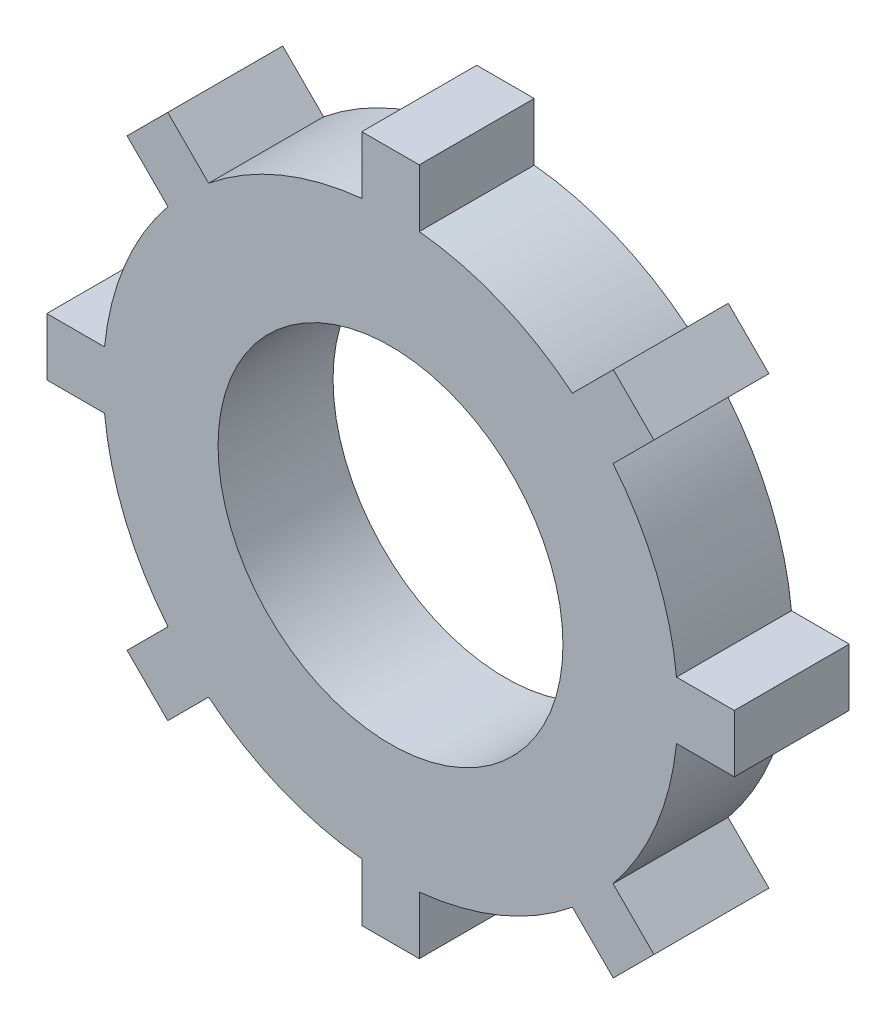
ISO-10303-21;
HEADER;
FILE_DESCRIPTION(('STEP AP214'),'2;1');
FILE_NAME('part.step','',(''),(''),'','','');
FILE_SCHEMA(('AUTOMOTIVE_DESIGN { 1 0 10303 214 1 1 1 1 }'));
ENDSEC;
DATA;
#1=APPLICATION_CONTEXT('core data for automotive mechanical design processes');
#2=APPLICATION_PROTOCOL_DEFINITION('international standard','automotive_design',2000,#1);
#3=PRODUCT_CONTEXT('',#1,'mechanical');
#4=PRODUCT('Part','Part','',(#3));
#5=PRODUCT_RELATED_PRODUCT_CATEGORY('part','',(#4));
#6=PRODUCT_DEFINITION_FORMATION('','',#4);
#7=PRODUCT_DEFINITION_CONTEXT('part definition',#1,'design');
#8=PRODUCT_DEFINITION('design','',#6,#7);
#9=PRODUCT_DEFINITION_SHAPE('','',#8);
#10=(LENGTH_UNIT() NAMED_UNIT(*) SI_UNIT(.MILLI.,.METRE.));
#11=(NAMED_UNIT(*) PLANE_ANGLE_UNIT() SI_UNIT($,.RADIAN.));
#12=(NAMED_UNIT(*) SI_UNIT($,.STERADIAN.) SOLID_ANGLE_UNIT());
#13=UNCERTAINTY_MEASURE_WITH_UNIT(LENGTH_MEASURE(1.E-05),#10,'distance_accuracy_value','');
#14=(GEOMETRIC_REPRESENTATION_CONTEXT(3) GLOBAL_UNCERTAINTY_ASSIGNED_CONTEXT((#13)) GLOBAL_UNIT_ASSIGNED_CONTEXT((#10,
#11,#12)) REPRESENTATION_CONTEXT('',''));
#15=CARTESIAN_POINT('',(0.,0.,0.));
#16=DIRECTION('',(0.,0.,1.));
#17=DIRECTION('',(1.,0.,0.));
#18=AXIS2_PLACEMENT_3D('',#15,#16,#17);
#19=CARTESIAN_POINT('',(0.,0.,10.));
#20=DIRECTION('',(0.,0.,1.));
#21=DIRECTION('',(1.,0.,0.));
#22=AXIS2_PLACEMENT_3D('',#19,#20,#21);
#23=PLANE('',#22);
#24=DIRECTION('',(-0.707106781186558,0.707106781186537,0.));
#25=VECTOR('',#24,1.);
#26=CARTESIAN_POINT('',(19.3780392557398,22.9135731616723,10.));
#27=LINE('',#26,#25);
#28=CARTESIAN_POINT('',(22.9135731616731,19.378039255739,10.));
#29=VERTEX_POINT('',#28);
#30=CARTESIAN_POINT('',(19.3780392557398,22.9135731616723,10.));
#31=VERTEX_POINT('',#30);
#32=EDGE_CURVE('E339',#29,#31,#27,.T.);
#33=ORIENTED_EDGE('',*,*,#32,.T.);
#34=DIRECTION('',(-0.707106781186546,-0.707106781186549,0.));
#35=VECTOR('',#34,1.);
#36=CARTESIAN_POINT('',(15.8212921463718,19.3568260523039,10.));
#37=LINE('',#36,#35);
#38=CARTESIAN_POINT('',(15.8212921463718,19.3568260523039,10.));
#39=VERTEX_POINT('',#38);
#40=EDGE_CURVE('E167',#31,#39,#37,.T.);
#41=ORIENTED_EDGE('',*,*,#40,.T.);
#42=CARTESIAN_POINT('',(0.,0.,10.));
#43=DIRECTION('',(0.,0.,1.));
#44=DIRECTION('',(1.,0.,0.));
#45=AXIS2_PLACEMENT_3D('',#42,#43,#44);
#46=CIRCLE('',#45,25.);
#47=CARTESIAN_POINT('',(2.49999999999975,24.8746859276655,10.));
#48=VERTEX_POINT('',#47);
#49=EDGE_CURVE('E426',#39,#48,#46,.T.);
#50=ORIENTED_EDGE('',*,*,#49,.T.);
#51=DIRECTION('',(0.,1.,0.));
#52=VECTOR('',#51,1.);
#53=CARTESIAN_POINT('',(2.49999999999995,29.9000000000001,10.));
#54=LINE('',#53,#52);
#55=CARTESIAN_POINT('',(2.49999999999995,29.9000000000001,10.));
#56=VERTEX_POINT('',#55);
#57=EDGE_CURVE('E445',#48,#56,#54,.T.);
#58=ORIENTED_EDGE('',*,*,#57,.T.);
#59=DIRECTION('',(-1.,0.,0.));
#60=VECTOR('',#59,1.);
#61=CARTESIAN_POINT('',(-2.5,29.8999999999999,10.));
#62=LINE('',#61,#60);
#63=CARTESIAN_POINT('',(-2.5,29.8999999999999,10.));
#64=VERTEX_POINT('',#63);
#65=EDGE_CURVE('E442',#56,#64,#62,.T.);
#66=ORIENTED_EDGE('',*,*,#65,.T.);
#67=DIRECTION('',(0.,-1.,0.));
#68=VECTOR('',#67,1.);
#69=CARTESIAN_POINT('',(-2.5,29.8999999999999,10.));
#70=LINE('',#69,#68);
#71=CARTESIAN_POINT('',(-2.49999999999997,24.8746859276655,10.));
#72=VERTEX_POINT('',#71);
#73=EDGE_CURVE('E444',#64,#72,#70,.T.);
#74=ORIENTED_EDGE('',*,*,#73,.T.);
#75=CARTESIAN_POINT('',(0.,0.,10.));
#76=DIRECTION('',(0.,0.,1.));
#77=DIRECTION('',(1.,0.,0.));
#78=AXIS2_PLACEMENT_3D('',#75,#76,#77);
#79=CIRCLE('',#78,25.);
#80=CARTESIAN_POINT('',(-15.8212921463718,19.3568260523043,10.));
#81=VERTEX_POINT('',#80);
#82=EDGE_CURVE('E447',#72,#81,#79,.T.);
#83=ORIENTED_EDGE('',*,*,#82,.T.);
#84=DIRECTION('',(-0.707106781186551,0.707106781186545,0.));
#85=VECTOR('',#84,1.);
#86=CARTESIAN_POINT('',(-15.8212921463718,19.3568260523043,10.));
#87=LINE('',#86,#85);
#88=CARTESIAN_POINT('',(-19.3780392557402,22.9135731616725,10.));
#89=VERTEX_POINT('',#88);
#90=EDGE_CURVE('E453',#81,#89,#87,.T.);
#91=ORIENTED_EDGE('',*,*,#90,.T.);
#92=DIRECTION('',(-0.707106781186544,-0.707106781186551,0.));
#93=VECTOR('',#92,1.);
#94=CARTESIAN_POINT('',(-19.3780392557402,22.9135731616725,10.));
#95=LINE('',#94,#93);
#96=CARTESIAN_POINT('',(-22.9135731616727,19.3780392557398,10.));
#97=VERTEX_POINT('',#96);
#98=EDGE_CURVE('E455',#89,#97,#95,.T.);
#99=ORIENTED_EDGE('',*,*,#98,.T.);
#100=DIRECTION('',(0.707106781186551,-0.707106781186545,0.));
#101=VECTOR('',#100,1.);
#102=CARTESIAN_POINT('',(-22.9135731616727,19.3780392557398,10.));
#103=LINE('',#102,#101);
#104=CARTESIAN_POINT('',(-19.3568260523045,15.8212921463713,10.));
#105=VERTEX_POINT('',#104);
#106=EDGE_CURVE('E457',#97,#105,#103,.T.);
#107=ORIENTED_EDGE('',*,*,#106,.T.);
#108=CARTESIAN_POINT('',(0.,0.,10.));
#109=DIRECTION('',(0.,0.,1.));
#110=DIRECTION('',(1.,0.,0.));
#111=AXIS2_PLACEMENT_3D('',#108,#109,#110);
#112=CIRCLE('',#111,25.);
#113=CARTESIAN_POINT('',(-24.8746859276658,2.49999999999995,10.));
#114=VERTEX_POINT('',#113);
#115=EDGE_CURVE('E459',#105,#114,#112,.T.);
#116=ORIENTED_EDGE('',*,*,#115,.T.);
#117=DIRECTION('',(-1.,0.,0.));
#118=VECTOR('',#117,1.);
#119=CARTESIAN_POINT('',(-29.9000000000003,2.49999999999995,10.));
#120=LINE('',#119,#118);
#121=CARTESIAN_POINT('',(-29.9000000000003,2.49999999999995,10.));
#122=VERTEX_POINT('',#121);
#123=EDGE_CURVE('E461',#114,#122,#120,.T.);
#124=ORIENTED_EDGE('',*,*,#123,.T.);
#125=DIRECTION('',(0.,-1.,0.));
#126=VECTOR('',#125,1.);
#127=CARTESIAN_POINT('',(-29.9000000000003,2.49999999999995,10.));
#128=LINE('',#127,#126);
#129=CARTESIAN_POINT('',(-29.8999999999997,-2.49999999999984,10.));
#130=VERTEX_POINT('',#129);
#131=EDGE_CURVE('E463',#122,#130,#128,.T.);
#132=ORIENTED_EDGE('',*,*,#131,.T.);
#133=DIRECTION('',(1.,0.,0.));
#134=VECTOR('',#133,1.);
#135=CARTESIAN_POINT('',(-29.8999999999997,-2.49999999999984,10.));
#136=LINE('',#135,#134);
#137=CARTESIAN_POINT('',(-24.8746859276656,-2.49999999999995,10.));
#138=VERTEX_POINT('',#137);
#139=EDGE_CURVE('E465',#130,#138,#136,.T.);
#140=ORIENTED_EDGE('',*,*,#139,.T.);
#141=CARTESIAN_POINT('',(0.,0.,10.));
#142=DIRECTION('',(0.,0.,1.));
#143=DIRECTION('',(1.,0.,0.));
#144=AXIS2_PLACEMENT_3D('',#141,#142,#143);
#145=CIRCLE('',#144,25.);
#146=CARTESIAN_POINT('',(-19.3568260523045,-15.8212921463717,10.));
#147=VERTEX_POINT('',#146);
#148=EDGE_CURVE('E467',#138,#147,#145,.T.);
#149=ORIENTED_EDGE('',*,*,#148,.T.);
#150=DIRECTION('',(-0.707106781186545,-0.707106781186551,0.));
#151=VECTOR('',#150,1.);
#152=CARTESIAN_POINT('',(-22.9135731616727,-19.37803925574,10.));
#153=LINE('',#152,#151);
#154=CARTESIAN_POINT('',(-22.9135731616727,-19.37803925574,10.));
#155=VERTEX_POINT('',#154);
#156=EDGE_CURVE('E469',#147,#155,#153,.T.);
#157=ORIENTED_EDGE('',*,*,#156,.T.);
#158=DIRECTION('',(0.707106781186549,-0.707106781186548,0.));
#159=VECTOR('',#158,1.);
#160=CARTESIAN_POINT('',(-19.3780392557398,-22.9135731616726,10.));
#161=LINE('',#160,#159);
#162=CARTESIAN_POINT('',(-19.3780392557398,-22.9135731616726,10.));
#163=VERTEX_POINT('',#162);
#164=EDGE_CURVE('E471',#155,#163,#161,.T.);
#165=ORIENTED_EDGE('',*,*,#164,.T.);
#166=DIRECTION('',(0.707106781186546,0.707106781186549,0.));
#167=VECTOR('',#166,1.);
#168=CARTESIAN_POINT('',(-15.8212921463716,-19.3568260523045,10.));
#169=LINE('',#168,#167);
#170=CARTESIAN_POINT('',(-15.8212921463716,-19.3568260523045,10.));
#171=VERTEX_POINT('',#170);
#172=EDGE_CURVE('E473',#163,#171,#169,.T.);
#173=ORIENTED_EDGE('',*,*,#172,.T.);
#174=CARTESIAN_POINT('',(0.,0.,10.));
#175=DIRECTION('',(0.,0.,1.));
#176=DIRECTION('',(1.,0.,0.));
#177=AXIS2_PLACEMENT_3D('',#174,#175,#176);
#178=CIRCLE('',#177,25.);
#179=CARTESIAN_POINT('',(-2.49999999999975,-24.8746859276656,10.));
#180=VERTEX_POINT('',#179);
#181=EDGE_CURVE('E475',#171,#180,#178,.T.);
#182=ORIENTED_EDGE('',*,*,#181,.T.);
#183=DIRECTION('',(0.,-1.,0.));
#184=VECTOR('',#183,1.);
#185=CARTESIAN_POINT('',(-2.49999999999975,-24.8746859276656,10.));
#186=LINE('',#185,#184);
#187=CARTESIAN_POINT('',(-2.49999999999986,-29.9000000000001,10.));
#188=VERTEX_POINT('',#187);
#189=EDGE_CURVE('E477',#180,#188,#186,.T.);
#190=ORIENTED_EDGE('',*,*,#189,.T.);
#191=DIRECTION('',(1.,0.,0.));
#192=VECTOR('',#191,1.);
#193=CARTESIAN_POINT('',(-2.49999999999986,-29.9000000000001,10.));
#194=LINE('',#193,#192);
#195=CARTESIAN_POINT('',(2.49999999999995,-29.9,10.));
#196=VERTEX_POINT('',#195);
#197=EDGE_CURVE('E479',#188,#196,#194,.T.);
#198=ORIENTED_EDGE('',*,*,#197,.T.);
#199=DIRECTION('',(0.,1.,0.));
#200=VECTOR('',#199,1.);
#201=CARTESIAN_POINT('',(2.4999999999997,-24.8746859276655,10.));
#202=LINE('',#201,#200);
#203=CARTESIAN_POINT('',(2.4999999999997,-24.8746859276655,10.));
#204=VERTEX_POINT('',#203);
#205=EDGE_CURVE('E481',#196,#204,#202,.T.);
#206=ORIENTED_EDGE('',*,*,#205,.T.);
#207=CARTESIAN_POINT('',(0.,0.,10.));
#208=DIRECTION('',(0.,0.,1.));
#209=DIRECTION('',(1.,0.,0.));
#210=AXIS2_PLACEMENT_3D('',#207,#208,#209);
#211=CIRCLE('',#210,25.);
#212=CARTESIAN_POINT('',(15.8212921463714,-19.3568260523041,10.));
#213=VERTEX_POINT('',#212);
#214=EDGE_CURVE('E483',#204,#213,#211,.T.);
#215=ORIENTED_EDGE('',*,*,#214,.T.);
#216=DIRECTION('',(0.707106781186551,-0.707106781186544,0.));
#217=VECTOR('',#216,1.);
#218=CARTESIAN_POINT('',(19.3780392557399,-22.9135731616726,10.));
#219=LINE('',#218,#217);
#220=CARTESIAN_POINT('',(19.3780392557399,-22.9135731616726,10.));
#221=VERTEX_POINT('',#220);
#222=EDGE_CURVE('E485',#213,#221,#219,.T.);
#223=ORIENTED_EDGE('',*,*,#222,.T.);
#224=DIRECTION('',(0.707106781186544,0.707106781186551,0.));
#225=VECTOR('',#224,1.);
#226=CARTESIAN_POINT('',(22.9135731616726,-19.3780392557399,10.));
#227=LINE('',#226,#225);
#228=CARTESIAN_POINT('',(22.9135731616726,-19.3780392557399,10.));
#229=VERTEX_POINT('',#228);
#230=EDGE_CURVE('E487',#221,#229,#227,.T.);
#231=ORIENTED_EDGE('',*,*,#230,.T.);
#232=DIRECTION('',(-0.707106781186552,0.707106781186544,0.));
#233=VECTOR('',#232,1.);
#234=CARTESIAN_POINT('',(19.356826052304,-15.8212921463714,10.));
#235=LINE('',#234,#233);
#236=CARTESIAN_POINT('',(19.356826052304,-15.8212921463714,10.));
#237=VERTEX_POINT('',#236);
#238=EDGE_CURVE('E489',#229,#237,#235,.T.);
#239=ORIENTED_EDGE('',*,*,#238,.T.);
#240=CARTESIAN_POINT('',(0.,0.,10.));
#241=DIRECTION('',(0.,0.,1.));
#242=DIRECTION('',(1.,0.,0.));
#243=AXIS2_PLACEMENT_3D('',#240,#241,#242);
#244=CIRCLE('',#243,25.);
#245=CARTESIAN_POINT('',(24.8746859276655,-2.50000000000028,10.));
#246=VERTEX_POINT('',#245);
#247=EDGE_CURVE('E491',#237,#246,#244,.T.);
#248=ORIENTED_EDGE('',*,*,#247,.T.);
#249=DIRECTION('',(1.,0.,0.));
#250=VECTOR('',#249,1.);
#251=CARTESIAN_POINT('',(24.8746859276655,-2.50000000000028,10.));
#252=LINE('',#251,#250);
#253=CARTESIAN_POINT('',(29.9000000000001,-2.50000000000022,10.));
#254=VERTEX_POINT('',#253);
#255=EDGE_CURVE('E493',#246,#254,#252,.T.);
#256=ORIENTED_EDGE('',*,*,#255,.T.);
#257=DIRECTION('',(0.,1.,0.));
#258=VECTOR('',#257,1.);
#259=CARTESIAN_POINT('',(29.8999999999998,2.5,10.));
#260=LINE('',#259,#258);
#261=CARTESIAN_POINT('',(29.8999999999998,2.5,10.));
#262=VERTEX_POINT('',#261);
#263=EDGE_CURVE('E258',#254,#262,#260,.T.);
#264=ORIENTED_EDGE('',*,*,#263,.T.);
#265=DIRECTION('',(-1.,0.,0.));
#266=VECTOR('',#265,1.);
#267=CARTESIAN_POINT('',(24.8746859276652,2.50000000000006,10.));
#268=LINE('',#267,#266);
#269=CARTESIAN_POINT('',(24.8746859276652,2.50000000000006,10.));
#270=VERTEX_POINT('',#269);
#271=EDGE_CURVE('E252',#262,#270,#268,.T.);
#272=ORIENTED_EDGE('',*,*,#271,.T.);
#273=CARTESIAN_POINT('',(0.,0.,10.));
#274=DIRECTION('',(0.,0.,1.));
#275=DIRECTION('',(1.,0.,0.));
#276=AXIS2_PLACEMENT_3D('',#273,#274,#275);
#277=CIRCLE('',#276,25.);
#278=CARTESIAN_POINT('',(19.3568260523045,15.8212921463712,10.));
#279=VERTEX_POINT('',#278);
#280=EDGE_CURVE('E256',#270,#279,#277,.T.);
#281=ORIENTED_EDGE('',*,*,#280,.T.);
#282=DIRECTION('',(0.70710678118664,0.707106781186457,0.));
#283=VECTOR('',#282,1.);
#284=CARTESIAN_POINT('',(22.9135731616731,19.378039255739,10.));
#285=LINE('',#284,#283);
#286=EDGE_CURVE('E52',#279,#29,#285,.T.);
#287=ORIENTED_EDGE('',*,*,#286,.T.);
#288=EDGE_LOOP('',(#33,#41,#50,#58,#66,#74,#83,#91,#99,#107,#116,#124,#132,#140,#149,#157,#165,
#173,#182,#190,#198,#206,#215,#223,#231,#239,#248,#256,#264,#272,#281,#287));
#289=FACE_BOUND('',#288,.T.);
#290=CARTESIAN_POINT('',(0.,0.,10.));
#291=DIRECTION('',(0.,0.,1.));
#292=DIRECTION('',(1.,0.,0.));
#293=AXIS2_PLACEMENT_3D('',#290,#291,#292);
#294=CIRCLE('',#293,15.);
#295=CARTESIAN_POINT('',(15.,0.,10.));
#296=VERTEX_POINT('',#295);
#297=EDGE_CURVE('E280',#296,#296,#294,.T.);
#298=ORIENTED_EDGE('',*,*,#297,.F.);
#299=EDGE_LOOP('',(#298));
#300=FACE_BOUND('',#299,.T.);
#301=ADVANCED_FACE('F35',(#289,#300),#23,.T.);
#302=CARTESIAN_POINT('',(0.,0.,0.));
#303=DIRECTION('',(0.,0.,1.));
#304=DIRECTION('',(1.,0.,0.));
#305=AXIS2_PLACEMENT_3D('',#302,#303,#304);
#306=PLANE('',#305);
#307=DIRECTION('',(-0.707106781186558,0.707106781186537,0.));
#308=VECTOR('',#307,1.);
#309=CARTESIAN_POINT('',(19.3780392557398,22.9135731616723,0.));
#310=LINE('',#309,#308);
#311=CARTESIAN_POINT('',(22.9135731616731,19.378039255739,0.));
#312=VERTEX_POINT('',#311);
#313=CARTESIAN_POINT('',(19.3780392557398,22.9135731616723,0.));
#314=VERTEX_POINT('',#313);
#315=EDGE_CURVE('E276',#312,#314,#310,.T.);
#316=ORIENTED_EDGE('',*,*,#315,.F.);
#317=DIRECTION('',(0.70710678118664,0.707106781186457,0.));
#318=VECTOR('',#317,1.);
#319=CARTESIAN_POINT('',(22.9135731616731,19.378039255739,0.));
#320=LINE('',#319,#318);
#321=CARTESIAN_POINT('',(19.3568260523045,15.8212921463712,0.));
#322=VERTEX_POINT('',#321);
#323=EDGE_CURVE('E159',#322,#312,#320,.T.);
#324=ORIENTED_EDGE('',*,*,#323,.F.);
#325=CARTESIAN_POINT('',(0.,0.,0.));
#326=DIRECTION('',(0.,0.,1.));
#327=DIRECTION('',(1.,0.,0.));
#328=AXIS2_PLACEMENT_3D('',#325,#326,#327);
#329=CIRCLE('',#328,25.);
#330=CARTESIAN_POINT('',(24.8746859276652,2.50000000000006,0.));
#331=VERTEX_POINT('',#330);
#332=EDGE_CURVE('E153',#331,#322,#329,.T.);
#333=ORIENTED_EDGE('',*,*,#332,.F.);
#334=DIRECTION('',(-1.,0.,0.));
#335=VECTOR('',#334,1.);
#336=CARTESIAN_POINT('',(24.8746859276652,2.50000000000006,0.));
#337=LINE('',#336,#335);
#338=CARTESIAN_POINT('',(29.8999999999998,2.5,0.));
#339=VERTEX_POINT('',#338);
#340=EDGE_CURVE('E266',#339,#331,#337,.T.);
#341=ORIENTED_EDGE('',*,*,#340,.F.);
#342=DIRECTION('',(0.,1.,0.));
#343=VECTOR('',#342,1.);
#344=CARTESIAN_POINT('',(29.8999999999998,2.5,0.));
#345=LINE('',#344,#343);
#346=CARTESIAN_POINT('',(29.9000000000001,-2.50000000000022,0.));
#347=VERTEX_POINT('',#346);
#348=EDGE_CURVE('E334',#347,#339,#345,.T.);
#349=ORIENTED_EDGE('',*,*,#348,.F.);
#350=DIRECTION('',(1.,0.,0.));
#351=VECTOR('',#350,1.);
#352=CARTESIAN_POINT('',(24.8746859276655,-2.50000000000028,0.));
#353=LINE('',#352,#351);
#354=CARTESIAN_POINT('',(24.8746859276655,-2.50000000000028,0.));
#355=VERTEX_POINT('',#354);
#356=EDGE_CURVE('E332',#355,#347,#353,.T.);
#357=ORIENTED_EDGE('',*,*,#356,.F.);
#358=CARTESIAN_POINT('',(0.,0.,0.));
#359=DIRECTION('',(0.,0.,1.));
#360=DIRECTION('',(1.,0.,0.));
#361=AXIS2_PLACEMENT_3D('',#358,#359,#360);
#362=CIRCLE('',#361,25.);
#363=CARTESIAN_POINT('',(19.356826052304,-15.8212921463714,0.));
#364=VERTEX_POINT('',#363);
#365=EDGE_CURVE('E330',#364,#355,#362,.T.);
#366=ORIENTED_EDGE('',*,*,#365,.F.);
#367=DIRECTION('',(-0.707106781186552,0.707106781186544,0.));
#368=VECTOR('',#367,1.);
#369=CARTESIAN_POINT('',(19.356826052304,-15.8212921463714,0.));
#370=LINE('',#369,#368);
#371=CARTESIAN_POINT('',(22.9135731616726,-19.3780392557399,0.));
#372=VERTEX_POINT('',#371);
#373=EDGE_CURVE('E328',#372,#364,#370,.T.);
#374=ORIENTED_EDGE('',*,*,#373,.F.);
#375=DIRECTION('',(0.707106781186544,0.707106781186551,0.));
#376=VECTOR('',#375,1.);
#377=CARTESIAN_POINT('',(22.9135731616726,-19.3780392557399,0.));
#378=LINE('',#377,#376);
#379=CARTESIAN_POINT('',(19.3780392557399,-22.9135731616726,0.));
#380=VERTEX_POINT('',#379);
#381=EDGE_CURVE('E326',#380,#372,#378,.T.);
#382=ORIENTED_EDGE('',*,*,#381,.F.);
#383=DIRECTION('',(0.707106781186551,-0.707106781186544,0.));
#384=VECTOR('',#383,1.);
#385=CARTESIAN_POINT('',(19.3780392557399,-22.9135731616726,0.));
#386=LINE('',#385,#384);
#387=CARTESIAN_POINT('',(15.8212921463714,-19.3568260523041,0.));
#388=VERTEX_POINT('',#387);
#389=EDGE_CURVE('E324',#388,#380,#386,.T.);
#390=ORIENTED_EDGE('',*,*,#389,.F.);
#391=CARTESIAN_POINT('',(0.,0.,0.));
#392=DIRECTION('',(0.,0.,1.));
#393=DIRECTION('',(1.,0.,0.));
#394=AXIS2_PLACEMENT_3D('',#391,#392,#393);
#395=CIRCLE('',#394,25.);
#396=CARTESIAN_POINT('',(2.4999999999997,-24.8746859276655,0.));
#397=VERTEX_POINT('',#396);
#398=EDGE_CURVE('E322',#397,#388,#395,.T.);
#399=ORIENTED_EDGE('',*,*,#398,.F.);
#400=DIRECTION('',(0.,1.,0.));
#401=VECTOR('',#400,1.);
#402=CARTESIAN_POINT('',(2.4999999999997,-24.8746859276655,0.));
#403=LINE('',#402,#401);
#404=CARTESIAN_POINT('',(2.49999999999995,-29.9,0.));
#405=VERTEX_POINT('',#404);
#406=EDGE_CURVE('E320',#405,#397,#403,.T.);
#407=ORIENTED_EDGE('',*,*,#406,.F.);
#408=DIRECTION('',(1.,0.,0.));
#409=VECTOR('',#408,1.);
#410=CARTESIAN_POINT('',(-2.49999999999986,-29.9000000000001,0.));
#411=LINE('',#410,#409);
#412=CARTESIAN_POINT('',(-2.49999999999986,-29.9000000000001,0.));
#413=VERTEX_POINT('',#412);
#414=EDGE_CURVE('E318',#413,#405,#411,.T.);
#415=ORIENTED_EDGE('',*,*,#414,.F.);
#416=DIRECTION('',(0.,-1.,0.));
#417=VECTOR('',#416,1.);
#418=CARTESIAN_POINT('',(-2.49999999999975,-24.8746859276656,0.));
#419=LINE('',#418,#417);
#420=CARTESIAN_POINT('',(-2.49999999999975,-24.8746859276656,0.));
#421=VERTEX_POINT('',#420);
#422=EDGE_CURVE('E316',#421,#413,#419,.T.);
#423=ORIENTED_EDGE('',*,*,#422,.F.);
#424=CARTESIAN_POINT('',(0.,0.,0.));
#425=DIRECTION('',(0.,0.,1.));
#426=DIRECTION('',(1.,0.,0.));
#427=AXIS2_PLACEMENT_3D('',#424,#425,#426);
#428=CIRCLE('',#427,25.);
#429=CARTESIAN_POINT('',(-15.8212921463716,-19.3568260523045,0.));
#430=VERTEX_POINT('',#429);
#431=EDGE_CURVE('E314',#430,#421,#428,.T.);
#432=ORIENTED_EDGE('',*,*,#431,.F.);
#433=DIRECTION('',(0.707106781186546,0.707106781186549,0.));
#434=VECTOR('',#433,1.);
#435=CARTESIAN_POINT('',(-15.8212921463716,-19.3568260523045,0.));
#436=LINE('',#435,#434);
#437=CARTESIAN_POINT('',(-19.3780392557398,-22.9135731616726,0.));
#438=VERTEX_POINT('',#437);
#439=EDGE_CURVE('E312',#438,#430,#436,.T.);
#440=ORIENTED_EDGE('',*,*,#439,.F.);
#441=DIRECTION('',(0.707106781186549,-0.707106781186548,0.));
#442=VECTOR('',#441,1.);
#443=CARTESIAN_POINT('',(-19.3780392557398,-22.9135731616726,0.));
#444=LINE('',#443,#442);
#445=CARTESIAN_POINT('',(-22.9135731616727,-19.37803925574,0.));
#446=VERTEX_POINT('',#445);
#447=EDGE_CURVE('E310',#446,#438,#444,.T.);
#448=ORIENTED_EDGE('',*,*,#447,.F.);
#449=DIRECTION('',(-0.707106781186545,-0.707106781186551,0.));
#450=VECTOR('',#449,1.);
#451=CARTESIAN_POINT('',(-22.9135731616727,-19.37803925574,0.));
#452=LINE('',#451,#450);
#453=CARTESIAN_POINT('',(-19.3568260523045,-15.8212921463717,0.));
#454=VERTEX_POINT('',#453);
#455=EDGE_CURVE('E308',#454,#446,#452,.T.);
#456=ORIENTED_EDGE('',*,*,#455,.F.);
#457=CARTESIAN_POINT('',(0.,0.,0.));
#458=DIRECTION('',(0.,0.,1.));
#459=DIRECTION('',(1.,0.,0.));
#460=AXIS2_PLACEMENT_3D('',#457,#458,#459);
#461=CIRCLE('',#460,25.);
#462=CARTESIAN_POINT('',(-24.8746859276656,-2.49999999999995,0.));
#463=VERTEX_POINT('',#462);
#464=EDGE_CURVE('E306',#463,#454,#461,.T.);
#465=ORIENTED_EDGE('',*,*,#464,.F.);
#466=DIRECTION('',(1.,0.,0.));
#467=VECTOR('',#466,1.);
#468=CARTESIAN_POINT('',(-29.8999999999997,-2.49999999999984,0.));
#469=LINE('',#468,#467);
#470=CARTESIAN_POINT('',(-29.8999999999997,-2.49999999999984,0.));
#471=VERTEX_POINT('',#470);
#472=EDGE_CURVE('E304',#471,#463,#469,.T.);
#473=ORIENTED_EDGE('',*,*,#472,.F.);
#474=DIRECTION('',(0.,-1.,0.));
#475=VECTOR('',#474,1.);
#476=CARTESIAN_POINT('',(-29.9000000000003,2.49999999999995,0.));
#477=LINE('',#476,#475);
#478=CARTESIAN_POINT('',(-29.9000000000003,2.49999999999995,0.));
#479=VERTEX_POINT('',#478);
#480=EDGE_CURVE('E302',#479,#471,#477,.T.);
#481=ORIENTED_EDGE('',*,*,#480,.F.);
#482=DIRECTION('',(-1.,0.,0.));
#483=VECTOR('',#482,1.);
#484=CARTESIAN_POINT('',(-29.9000000000003,2.49999999999995,0.));
#485=LINE('',#484,#483);
#486=CARTESIAN_POINT('',(-24.8746859276658,2.49999999999995,0.));
#487=VERTEX_POINT('',#486);
#488=EDGE_CURVE('E300',#487,#479,#485,.T.);
#489=ORIENTED_EDGE('',*,*,#488,.F.);
#490=CARTESIAN_POINT('',(0.,0.,0.));
#491=DIRECTION('',(0.,0.,1.));
#492=DIRECTION('',(1.,0.,0.));
#493=AXIS2_PLACEMENT_3D('',#490,#491,#492);
#494=CIRCLE('',#493,25.);
#495=CARTESIAN_POINT('',(-19.3568260523045,15.8212921463713,0.));
#496=VERTEX_POINT('',#495);
#497=EDGE_CURVE('E298',#496,#487,#494,.T.);
#498=ORIENTED_EDGE('',*,*,#497,.F.);
#499=DIRECTION('',(0.707106781186551,-0.707106781186545,0.));
#500=VECTOR('',#499,1.);
#501=CARTESIAN_POINT('',(-22.9135731616727,19.3780392557398,0.));
#502=LINE('',#501,#500);
#503=CARTESIAN_POINT('',(-22.9135731616727,19.3780392557398,0.));
#504=VERTEX_POINT('',#503);
#505=EDGE_CURVE('E296',#504,#496,#502,.T.);
#506=ORIENTED_EDGE('',*,*,#505,.F.);
#507=DIRECTION('',(-0.707106781186544,-0.707106781186551,0.));
#508=VECTOR('',#507,1.);
#509=CARTESIAN_POINT('',(-19.3780392557402,22.9135731616725,0.));
#510=LINE('',#509,#508);
#511=CARTESIAN_POINT('',(-19.3780392557402,22.9135731616725,0.));
#512=VERTEX_POINT('',#511);
#513=EDGE_CURVE('E294',#512,#504,#510,.T.);
#514=ORIENTED_EDGE('',*,*,#513,.F.);
#515=DIRECTION('',(-0.707106781186551,0.707106781186545,0.));
#516=VECTOR('',#515,1.);
#517=CARTESIAN_POINT('',(-15.8212921463718,19.3568260523043,0.));
#518=LINE('',#517,#516);
#519=CARTESIAN_POINT('',(-15.8212921463718,19.3568260523043,0.));
#520=VERTEX_POINT('',#519);
#521=EDGE_CURVE('E292',#520,#512,#518,.T.);
#522=ORIENTED_EDGE('',*,*,#521,.F.);
#523=CARTESIAN_POINT('',(0.,0.,0.));
#524=DIRECTION('',(0.,0.,1.));
#525=DIRECTION('',(1.,0.,0.));
#526=AXIS2_PLACEMENT_3D('',#523,#524,#525);
#527=CIRCLE('',#526,25.);
#528=CARTESIAN_POINT('',(-2.49999999999997,24.8746859276655,0.));
#529=VERTEX_POINT('',#528);
#530=EDGE_CURVE('E290',#529,#520,#527,.T.);
#531=ORIENTED_EDGE('',*,*,#530,.F.);
#532=DIRECTION('',(0.,-1.,0.));
#533=VECTOR('',#532,1.);
#534=CARTESIAN_POINT('',(-2.5,29.8999999999999,0.));
#535=LINE('',#534,#533);
#536=CARTESIAN_POINT('',(-2.5,29.8999999999999,0.));
#537=VERTEX_POINT('',#536);
#538=EDGE_CURVE('E288',#537,#529,#535,.T.);
#539=ORIENTED_EDGE('',*,*,#538,.F.);
#540=DIRECTION('',(-1.,0.,0.));
#541=VECTOR('',#540,1.);
#542=CARTESIAN_POINT('',(-2.5,29.8999999999999,0.));
#543=LINE('',#542,#541);
#544=CARTESIAN_POINT('',(2.49999999999995,29.9000000000001,0.));
#545=VERTEX_POINT('',#544);
#546=EDGE_CURVE('E286',#545,#537,#543,.T.);
#547=ORIENTED_EDGE('',*,*,#546,.F.);
#548=DIRECTION('',(0.,1.,0.));
#549=VECTOR('',#548,1.);
#550=CARTESIAN_POINT('',(2.49999999999995,29.9000000000001,0.));
#551=LINE('',#550,#549);
#552=CARTESIAN_POINT('',(2.49999999999975,24.8746859276655,0.));
#553=VERTEX_POINT('',#552);
#554=EDGE_CURVE('E284',#553,#545,#551,.T.);
#555=ORIENTED_EDGE('',*,*,#554,.F.);
#556=CARTESIAN_POINT('',(0.,0.,0.));
#557=DIRECTION('',(0.,0.,1.));
#558=DIRECTION('',(1.,0.,0.));
#559=AXIS2_PLACEMENT_3D('',#556,#557,#558);
#560=CIRCLE('',#559,25.);
#561=CARTESIAN_POINT('',(15.8212921463718,19.3568260523039,0.));
#562=VERTEX_POINT('',#561);
#563=EDGE_CURVE('E282',#562,#553,#560,.T.);
#564=ORIENTED_EDGE('',*,*,#563,.F.);
#565=DIRECTION('',(-0.707106781186546,-0.707106781186549,0.));
#566=VECTOR('',#565,1.);
#567=CARTESIAN_POINT('',(15.8212921463718,19.3568260523039,0.));
#568=LINE('',#567,#566);
#569=EDGE_CURVE('E279',#314,#562,#568,.T.);
#570=ORIENTED_EDGE('',*,*,#569,.F.);
#571=EDGE_LOOP('',(#316,#324,#333,#341,#349,#357,#366,#374,#382,#390,#399,#407,#415,#423,#432,
#440,#448,#456,#465,#473,#481,#489,#498,#506,#514,#522,#531,#539,#547,#555,#564,#570));
#572=FACE_BOUND('',#571,.T.);
#573=CARTESIAN_POINT('',(0.,0.,0.));
#574=DIRECTION('',(0.,0.,1.));
#575=DIRECTION('',(1.,0.,0.));
#576=AXIS2_PLACEMENT_3D('',#573,#574,#575);
#577=CIRCLE('',#576,15.);
#578=CARTESIAN_POINT('',(15.,0.,0.));
#579=VERTEX_POINT('',#578);
#580=EDGE_CURVE('E830',#579,#579,#577,.T.);
#581=ORIENTED_EDGE('',*,*,#580,.T.);
#582=EDGE_LOOP('',(#581));
#583=FACE_BOUND('',#582,.T.);
#584=ADVANCED_FACE('F430',(#572,#583),#306,.F.);
#585=CARTESIAN_POINT('',(19.3780392557398,22.9135731616723,10.));
#586=DIRECTION('',(-0.707106781186537,-0.707106781186558,0.));
#587=DIRECTION('',(0.707106781186559,-0.707106781186537,0.));
#588=AXIS2_PLACEMENT_3D('',#585,#586,#587);
#589=PLANE('',#588);
#590=ORIENTED_EDGE('',*,*,#315,.T.);
#591=DIRECTION('',(0.,0.,-1.));
#592=VECTOR('',#591,1.);
#593=CARTESIAN_POINT('',(19.3780392557398,22.9135731616723,10.));
#594=LINE('',#593,#592);
#595=EDGE_CURVE('E11',#31,#314,#594,.T.);
#596=ORIENTED_EDGE('',*,*,#595,.F.);
#597=ORIENTED_EDGE('',*,*,#32,.F.);
#598=DIRECTION('',(0.,0.,-1.));
#599=VECTOR('',#598,1.);
#600=CARTESIAN_POINT('',(22.9135731616731,19.378039255739,10.));
#601=LINE('',#600,#599);
#602=EDGE_CURVE('E272',#29,#312,#601,.T.);
#603=ORIENTED_EDGE('',*,*,#602,.T.);
#604=EDGE_LOOP('',(#590,#596,#597,#603));
#605=FACE_BOUND('',#604,.T.);
#606=ADVANCED_FACE('F37',(#605),#589,.F.);
#607=CARTESIAN_POINT('',(15.8212921463718,19.3568260523039,10.));
#608=DIRECTION('',(0.707106781186549,-0.707106781186547,0.));
#609=DIRECTION('',(0.707106781186547,0.707106781186549,0.));
#610=AXIS2_PLACEMENT_3D('',#607,#608,#609);
#611=PLANE('',#610);
#612=ORIENTED_EDGE('',*,*,#569,.T.);
#613=DIRECTION('',(0.,0.,-1.));
#614=VECTOR('',#613,1.);
#615=CARTESIAN_POINT('',(15.8212921463718,19.3568260523039,10.));
#616=LINE('',#615,#614);
#617=EDGE_CURVE('E44',#39,#562,#616,.T.);
#618=ORIENTED_EDGE('',*,*,#617,.F.);
#619=ORIENTED_EDGE('',*,*,#40,.F.);
#620=ORIENTED_EDGE('',*,*,#595,.T.);
#621=EDGE_LOOP('',(#612,#618,#619,#620));
#622=FACE_BOUND('',#621,.T.);
#623=ADVANCED_FACE('F527',(#622),#611,.F.);
#624=CARTESIAN_POINT('',(0.,0.,10.));
#625=DIRECTION('',(0.,0.,-1.));
#626=DIRECTION('',(-1.,0.,0.));
#627=AXIS2_PLACEMENT_3D('',#624,#625,#626);
#628=CYLINDRICAL_SURFACE('',#627,25.);
#629=ORIENTED_EDGE('',*,*,#563,.T.);
#630=DIRECTION('',(0.,0.,-1.));
#631=VECTOR('',#630,1.);
#632=CARTESIAN_POINT('',(2.49999999999975,24.8746859276655,10.));
#633=LINE('',#632,#631);
#634=EDGE_CURVE('E418',#48,#553,#633,.T.);
#635=ORIENTED_EDGE('',*,*,#634,.F.);
#636=ORIENTED_EDGE('',*,*,#49,.F.);
#637=ORIENTED_EDGE('',*,*,#617,.T.);
#638=EDGE_LOOP('',(#629,#635,#636,#637));
#639=FACE_BOUND('',#638,.T.);
#640=ADVANCED_FACE('F424',(#639),#628,.T.);
#641=CARTESIAN_POINT('',(2.49999999999995,29.9000000000001,10.));
#642=DIRECTION('',(-1.,0.,0.));
#643=DIRECTION('',(0.,-1.,0.));
#644=AXIS2_PLACEMENT_3D('',#641,#642,#643);
#645=PLANE('',#644);
#646=ORIENTED_EDGE('',*,*,#554,.T.);
#647=DIRECTION('',(0.,0.,-1.));
#648=VECTOR('',#647,1.);
#649=CARTESIAN_POINT('',(2.49999999999995,29.9000000000001,10.));
#650=LINE('',#649,#648);
#651=EDGE_CURVE('E415',#56,#545,#650,.T.);
#652=ORIENTED_EDGE('',*,*,#651,.F.);
#653=ORIENTED_EDGE('',*,*,#57,.F.);
#654=ORIENTED_EDGE('',*,*,#634,.T.);
#655=EDGE_LOOP('',(#646,#652,#653,#654));
#656=FACE_BOUND('',#655,.T.);
#657=ADVANCED_FACE('F436',(#656),#645,.F.);
#658=CARTESIAN_POINT('',(-2.5,29.8999999999999,10.));
#659=DIRECTION('',(0.,-1.,0.));
#660=DIRECTION('',(0.,0.,-1.));
#661=AXIS2_PLACEMENT_3D('',#658,#659,#660);
#662=PLANE('',#661);
#663=ORIENTED_EDGE('',*,*,#546,.T.);
#664=DIRECTION('',(0.,0.,-1.));
#665=VECTOR('',#664,1.);
#666=CARTESIAN_POINT('',(-2.5,29.8999999999999,10.));
#667=LINE('',#666,#665);
#668=EDGE_CURVE('E412',#64,#537,#667,.T.);
#669=ORIENTED_EDGE('',*,*,#668,.F.);
#670=ORIENTED_EDGE('',*,*,#65,.F.);
#671=ORIENTED_EDGE('',*,*,#651,.T.);
#672=EDGE_LOOP('',(#663,#669,#670,#671));
#673=FACE_BOUND('',#672,.T.);
#674=ADVANCED_FACE('F440',(#673),#662,.F.);
#675=CARTESIAN_POINT('',(-2.5,29.8999999999999,10.));
#676=DIRECTION('',(1.,0.,0.));
#677=DIRECTION('',(0.,1.,0.));
#678=AXIS2_PLACEMENT_3D('',#675,#676,#677);
#679=PLANE('',#678);
#680=ORIENTED_EDGE('',*,*,#538,.T.);
#681=DIRECTION('',(0.,0.,-1.));
#682=VECTOR('',#681,1.);
#683=CARTESIAN_POINT('',(-2.49999999999997,24.8746859276655,10.));
#684=LINE('',#683,#682);
#685=EDGE_CURVE('E409',#72,#529,#684,.T.);
#686=ORIENTED_EDGE('',*,*,#685,.F.);
#687=ORIENTED_EDGE('',*,*,#73,.F.);
#688=ORIENTED_EDGE('',*,*,#668,.T.);
#689=EDGE_LOOP('',(#680,#686,#687,#688));
#690=FACE_BOUND('',#689,.T.);
#691=ADVANCED_FACE('F540',(#690),#679,.F.);
#692=CARTESIAN_POINT('',(0.,0.,10.));
#693=DIRECTION('',(0.,0.,-1.));
#694=DIRECTION('',(-1.,0.,0.));
#695=AXIS2_PLACEMENT_3D('',#692,#693,#694);
#696=CYLINDRICAL_SURFACE('',#695,25.);
#697=ORIENTED_EDGE('',*,*,#530,.T.);
#698=DIRECTION('',(0.,0.,-1.));
#699=VECTOR('',#698,1.);
#700=CARTESIAN_POINT('',(-15.8212921463718,19.3568260523043,10.));
#701=LINE('',#700,#699);
#702=EDGE_CURVE('E406',#81,#520,#701,.T.);
#703=ORIENTED_EDGE('',*,*,#702,.F.);
#704=ORIENTED_EDGE('',*,*,#82,.F.);
#705=ORIENTED_EDGE('',*,*,#685,.T.);
#706=EDGE_LOOP('',(#697,#703,#704,#705));
#707=FACE_BOUND('',#706,.T.);
#708=ADVANCED_FACE('F543',(#707),#696,.T.);
#709=CARTESIAN_POINT('',(-15.8212921463718,19.3568260523043,10.));
#710=DIRECTION('',(-0.707106781186545,-0.707106781186551,0.));
#711=DIRECTION('',(0.707106781186551,-0.707106781186545,0.));
#712=AXIS2_PLACEMENT_3D('',#709,#710,#711);
#713=PLANE('',#712);
#714=ORIENTED_EDGE('',*,*,#521,.T.);
#715=DIRECTION('',(0.,0.,-1.));
#716=VECTOR('',#715,1.);
#717=CARTESIAN_POINT('',(-19.3780392557402,22.9135731616725,10.));
#718=LINE('',#717,#716);
#719=EDGE_CURVE('E403',#89,#512,#718,.T.);
#720=ORIENTED_EDGE('',*,*,#719,.F.);
#721=ORIENTED_EDGE('',*,*,#90,.F.);
#722=ORIENTED_EDGE('',*,*,#702,.T.);
#723=EDGE_LOOP('',(#714,#720,#721,#722));
#724=FACE_BOUND('',#723,.T.);
#725=ADVANCED_FACE('F547',(#724),#713,.F.);
#726=CARTESIAN_POINT('',(-19.3780392557402,22.9135731616725,10.));
#727=DIRECTION('',(0.707106781186551,-0.707106781186544,0.));
#728=DIRECTION('',(0.707106781186544,0.707106781186551,0.));
#729=AXIS2_PLACEMENT_3D('',#726,#727,#728);
#730=PLANE('',#729);
#731=ORIENTED_EDGE('',*,*,#513,.T.);
#732=DIRECTION('',(0.,0.,-1.));
#733=VECTOR('',#732,1.);
#734=CARTESIAN_POINT('',(-22.9135731616727,19.3780392557398,10.));
#735=LINE('',#734,#733);
#736=EDGE_CURVE('E400',#97,#504,#735,.T.);
#737=ORIENTED_EDGE('',*,*,#736,.F.);
#738=ORIENTED_EDGE('',*,*,#98,.F.);
#739=ORIENTED_EDGE('',*,*,#719,.T.);
#740=EDGE_LOOP('',(#731,#737,#738,#739));
#741=FACE_BOUND('',#740,.T.);
#742=ADVANCED_FACE('F551',(#741),#730,.F.);
#743=CARTESIAN_POINT('',(-22.9135731616727,19.3780392557398,10.));
#744=DIRECTION('',(0.707106781186546,0.707106781186551,0.));
#745=DIRECTION('',(-0.707106781186551,0.707106781186546,0.));
#746=AXIS2_PLACEMENT_3D('',#743,#744,#745);
#747=PLANE('',#746);
#748=ORIENTED_EDGE('',*,*,#505,.T.);
#749=DIRECTION('',(0.,0.,-1.));
#750=VECTOR('',#749,1.);
#751=CARTESIAN_POINT('',(-19.3568260523045,15.8212921463713,10.));
#752=LINE('',#751,#750);
#753=EDGE_CURVE('E397',#105,#496,#752,.T.);
#754=ORIENTED_EDGE('',*,*,#753,.F.);
#755=ORIENTED_EDGE('',*,*,#106,.F.);
#756=ORIENTED_EDGE('',*,*,#736,.T.);
#757=EDGE_LOOP('',(#748,#754,#755,#756));
#758=FACE_BOUND('',#757,.T.);
#759=ADVANCED_FACE('F555',(#758),#747,.F.);
#760=CARTESIAN_POINT('',(0.,0.,10.));
#761=DIRECTION('',(0.,0.,-1.));
#762=DIRECTION('',(-1.,0.,0.));
#763=AXIS2_PLACEMENT_3D('',#760,#761,#762);
#764=CYLINDRICAL_SURFACE('',#763,25.);
#765=ORIENTED_EDGE('',*,*,#497,.T.);
#766=DIRECTION('',(0.,0.,-1.));
#767=VECTOR('',#766,1.);
#768=CARTESIAN_POINT('',(-24.8746859276658,2.49999999999995,10.));
#769=LINE('',#768,#767);
#770=EDGE_CURVE('E394',#114,#487,#769,.T.);
#771=ORIENTED_EDGE('',*,*,#770,.F.);
#772=ORIENTED_EDGE('',*,*,#115,.F.);
#773=ORIENTED_EDGE('',*,*,#753,.T.);
#774=EDGE_LOOP('',(#765,#771,#772,#773));
#775=FACE_BOUND('',#774,.T.);
#776=ADVANCED_FACE('F559',(#775),#764,.T.);
#777=CARTESIAN_POINT('',(-29.9000000000003,2.49999999999995,10.));
#778=DIRECTION('',(0.,-1.,0.));
#779=DIRECTION('',(0.,0.,-1.));
#780=AXIS2_PLACEMENT_3D('',#777,#778,#779);
#781=PLANE('',#780);
#782=ORIENTED_EDGE('',*,*,#488,.T.);
#783=DIRECTION('',(0.,0.,-1.));
#784=VECTOR('',#783,1.);
#785=CARTESIAN_POINT('',(-29.9000000000003,2.49999999999995,10.));
#786=LINE('',#785,#784);
#787=EDGE_CURVE('E391',#122,#479,#786,.T.);
#788=ORIENTED_EDGE('',*,*,#787,.F.);
#789=ORIENTED_EDGE('',*,*,#123,.F.);
#790=ORIENTED_EDGE('',*,*,#770,.T.);
#791=EDGE_LOOP('',(#782,#788,#789,#790));
#792=FACE_BOUND('',#791,.T.);
#793=ADVANCED_FACE('F563',(#792),#781,.F.);
#794=CARTESIAN_POINT('',(-29.9000000000003,2.49999999999995,10.));
#795=DIRECTION('',(1.,0.,0.));
#796=DIRECTION('',(0.,0.,-1.));
#797=AXIS2_PLACEMENT_3D('',#794,#795,#796);
#798=PLANE('',#797);
#799=ORIENTED_EDGE('',*,*,#480,.T.);
#800=DIRECTION('',(0.,0.,-1.));
#801=VECTOR('',#800,1.);
#802=CARTESIAN_POINT('',(-29.8999999999997,-2.49999999999984,10.));
#803=LINE('',#802,#801);
#804=EDGE_CURVE('E388',#130,#471,#803,.T.);
#805=ORIENTED_EDGE('',*,*,#804,.F.);
#806=ORIENTED_EDGE('',*,*,#131,.F.);
#807=ORIENTED_EDGE('',*,*,#787,.T.);
#808=EDGE_LOOP('',(#799,#805,#806,#807));
#809=FACE_BOUND('',#808,.T.);
#810=ADVANCED_FACE('F567',(#809),#798,.F.);
#811=CARTESIAN_POINT('',(-29.8999999999997,-2.49999999999984,10.));
#812=DIRECTION('',(0.,1.,0.));
#813=DIRECTION('',(0.,0.,1.));
#814=AXIS2_PLACEMENT_3D('',#811,#812,#813);
#815=PLANE('',#814);
#816=ORIENTED_EDGE('',*,*,#472,.T.);
#817=DIRECTION('',(0.,0.,-1.));
#818=VECTOR('',#817,1.);
#819=CARTESIAN_POINT('',(-24.8746859276656,-2.49999999999995,10.));
#820=LINE('',#819,#818);
#821=EDGE_CURVE('E385',#138,#463,#820,.T.);
#822=ORIENTED_EDGE('',*,*,#821,.F.);
#823=ORIENTED_EDGE('',*,*,#139,.F.);
#824=ORIENTED_EDGE('',*,*,#804,.T.);
#825=EDGE_LOOP('',(#816,#822,#823,#824));
#826=FACE_BOUND('',#825,.T.);
#827=ADVANCED_FACE('F571',(#826),#815,.F.);
#828=CARTESIAN_POINT('',(0.,0.,10.));
#829=DIRECTION('',(0.,0.,-1.));
#830=DIRECTION('',(-1.,0.,0.));
#831=AXIS2_PLACEMENT_3D('',#828,#829,#830);
#832=CYLINDRICAL_SURFACE('',#831,25.);
#833=ORIENTED_EDGE('',*,*,#464,.T.);
#834=DIRECTION('',(0.,0.,-1.));
#835=VECTOR('',#834,1.);
#836=CARTESIAN_POINT('',(-19.3568260523045,-15.8212921463717,10.));
#837=LINE('',#836,#835);
#838=EDGE_CURVE('E382',#147,#454,#837,.T.);
#839=ORIENTED_EDGE('',*,*,#838,.F.);
#840=ORIENTED_EDGE('',*,*,#148,.F.);
#841=ORIENTED_EDGE('',*,*,#821,.T.);
#842=EDGE_LOOP('',(#833,#839,#840,#841));
#843=FACE_BOUND('',#842,.T.);
#844=ADVANCED_FACE('F575',(#843),#832,.T.);
#845=CARTESIAN_POINT('',(-22.9135731616727,-19.37803925574,10.));
#846=DIRECTION('',(0.707106781186551,-0.707106781186545,0.));
#847=DIRECTION('',(0.707106781186545,0.707106781186551,0.));
#848=AXIS2_PLACEMENT_3D('',#845,#846,#847);
#849=PLANE('',#848);
#850=ORIENTED_EDGE('',*,*,#455,.T.);
#851=DIRECTION('',(0.,0.,-1.));
#852=VECTOR('',#851,1.);
#853=CARTESIAN_POINT('',(-22.9135731616727,-19.37803925574,10.));
#854=LINE('',#853,#852);
#855=EDGE_CURVE('E379',#155,#446,#854,.T.);
#856=ORIENTED_EDGE('',*,*,#855,.F.);
#857=ORIENTED_EDGE('',*,*,#156,.F.);
#858=ORIENTED_EDGE('',*,*,#838,.T.);
#859=EDGE_LOOP('',(#850,#856,#857,#858));
#860=FACE_BOUND('',#859,.T.);
#861=ADVANCED_FACE('F579',(#860),#849,.F.);
#862=CARTESIAN_POINT('',(-19.3780392557398,-22.9135731616726,10.));
#863=DIRECTION('',(0.707106781186548,0.707106781186549,0.));
#864=DIRECTION('',(-0.707106781186549,0.707106781186548,0.));
#865=AXIS2_PLACEMENT_3D('',#862,#863,#864);
#866=PLANE('',#865);
#867=ORIENTED_EDGE('',*,*,#447,.T.);
#868=DIRECTION('',(0.,0.,-1.));
#869=VECTOR('',#868,1.);
#870=CARTESIAN_POINT('',(-19.3780392557398,-22.9135731616726,10.));
#871=LINE('',#870,#869);
#872=EDGE_CURVE('E376',#163,#438,#871,.T.);
#873=ORIENTED_EDGE('',*,*,#872,.F.);
#874=ORIENTED_EDGE('',*,*,#164,.F.);
#875=ORIENTED_EDGE('',*,*,#855,.T.);
#876=EDGE_LOOP('',(#867,#873,#874,#875));
#877=FACE_BOUND('',#876,.T.);
#878=ADVANCED_FACE('F583',(#877),#866,.F.);
#879=CARTESIAN_POINT('',(-15.8212921463716,-19.3568260523045,10.));
#880=DIRECTION('',(-0.707106781186549,0.707106781186547,0.));
#881=DIRECTION('',(-0.707106781186547,-0.707106781186549,0.));
#882=AXIS2_PLACEMENT_3D('',#879,#880,#881);
#883=PLANE('',#882);
#884=ORIENTED_EDGE('',*,*,#439,.T.);
#885=DIRECTION('',(0.,0.,-1.));
#886=VECTOR('',#885,1.);
#887=CARTESIAN_POINT('',(-15.8212921463716,-19.3568260523045,10.));
#888=LINE('',#887,#886);
#889=EDGE_CURVE('E373',#171,#430,#888,.T.);
#890=ORIENTED_EDGE('',*,*,#889,.F.);
#891=ORIENTED_EDGE('',*,*,#172,.F.);
#892=ORIENTED_EDGE('',*,*,#872,.T.);
#893=EDGE_LOOP('',(#884,#890,#891,#892));
#894=FACE_BOUND('',#893,.T.);
#895=ADVANCED_FACE('F587',(#894),#883,.F.);
#896=CARTESIAN_POINT('',(0.,0.,10.));
#897=DIRECTION('',(0.,0.,-1.));
#898=DIRECTION('',(-1.,0.,0.));
#899=AXIS2_PLACEMENT_3D('',#896,#897,#898);
#900=CYLINDRICAL_SURFACE('',#899,25.);
#901=ORIENTED_EDGE('',*,*,#431,.T.);
#902=DIRECTION('',(0.,0.,-1.));
#903=VECTOR('',#902,1.);
#904=CARTESIAN_POINT('',(-2.49999999999975,-24.8746859276656,10.));
#905=LINE('',#904,#903);
#906=EDGE_CURVE('E370',#180,#421,#905,.T.);
#907=ORIENTED_EDGE('',*,*,#906,.F.);
#908=ORIENTED_EDGE('',*,*,#181,.F.);
#909=ORIENTED_EDGE('',*,*,#889,.T.);
#910=EDGE_LOOP('',(#901,#907,#908,#909));
#911=FACE_BOUND('',#910,.T.);
#912=ADVANCED_FACE('F591',(#911),#900,.T.);
#913=CARTESIAN_POINT('',(-2.49999999999975,-24.8746859276656,10.));
#914=DIRECTION('',(1.,0.,0.));
#915=DIRECTION('',(0.,1.,0.));
#916=AXIS2_PLACEMENT_3D('',#913,#914,#915);
#917=PLANE('',#916);
#918=ORIENTED_EDGE('',*,*,#422,.T.);
#919=DIRECTION('',(0.,0.,-1.));
#920=VECTOR('',#919,1.);
#921=CARTESIAN_POINT('',(-2.49999999999986,-29.9000000000001,10.));
#922=LINE('',#921,#920);
#923=EDGE_CURVE('E367',#188,#413,#922,.T.);
#924=ORIENTED_EDGE('',*,*,#923,.F.);
#925=ORIENTED_EDGE('',*,*,#189,.F.);
#926=ORIENTED_EDGE('',*,*,#906,.T.);
#927=EDGE_LOOP('',(#918,#924,#925,#926));
#928=FACE_BOUND('',#927,.T.);
#929=ADVANCED_FACE('F595',(#928),#917,.F.);
#930=CARTESIAN_POINT('',(-2.49999999999986,-29.9000000000001,10.));
#931=DIRECTION('',(0.,1.,0.));
#932=DIRECTION('',(0.,0.,1.));
#933=AXIS2_PLACEMENT_3D('',#930,#931,#932);
#934=PLANE('',#933);
#935=ORIENTED_EDGE('',*,*,#414,.T.);
#936=DIRECTION('',(0.,0.,-1.));
#937=VECTOR('',#936,1.);
#938=CARTESIAN_POINT('',(2.49999999999995,-29.9,10.));
#939=LINE('',#938,#937);
#940=EDGE_CURVE('E364',#196,#405,#939,.T.);
#941=ORIENTED_EDGE('',*,*,#940,.F.);
#942=ORIENTED_EDGE('',*,*,#197,.F.);
#943=ORIENTED_EDGE('',*,*,#923,.T.);
#944=EDGE_LOOP('',(#935,#941,#942,#943));
#945=FACE_BOUND('',#944,.T.);
#946=ADVANCED_FACE('F599',(#945),#934,.F.);
#947=CARTESIAN_POINT('',(2.4999999999997,-24.8746859276655,10.));
#948=DIRECTION('',(-1.,0.,0.));
#949=DIRECTION('',(0.,-1.,0.));
#950=AXIS2_PLACEMENT_3D('',#947,#948,#949);
#951=PLANE('',#950);
#952=ORIENTED_EDGE('',*,*,#406,.T.);
#953=DIRECTION('',(0.,0.,-1.));
#954=VECTOR('',#953,1.);
#955=CARTESIAN_POINT('',(2.4999999999997,-24.8746859276655,10.));
#956=LINE('',#955,#954);
#957=EDGE_CURVE('E361',#204,#397,#956,.T.);
#958=ORIENTED_EDGE('',*,*,#957,.F.);
#959=ORIENTED_EDGE('',*,*,#205,.F.);
#960=ORIENTED_EDGE('',*,*,#940,.T.);
#961=EDGE_LOOP('',(#952,#958,#959,#960));
#962=FACE_BOUND('',#961,.T.);
#963=ADVANCED_FACE('F603',(#962),#951,.F.);
#964=CARTESIAN_POINT('',(0.,0.,10.));
#965=DIRECTION('',(0.,0.,-1.));
#966=DIRECTION('',(-1.,0.,0.));
#967=AXIS2_PLACEMENT_3D('',#964,#965,#966);
#968=CYLINDRICAL_SURFACE('',#967,25.);
#969=ORIENTED_EDGE('',*,*,#398,.T.);
#970=DIRECTION('',(0.,0.,-1.));
#971=VECTOR('',#970,1.);
#972=CARTESIAN_POINT('',(15.8212921463714,-19.3568260523041,10.));
#973=LINE('',#972,#971);
#974=EDGE_CURVE('E358',#213,#388,#973,.T.);
#975=ORIENTED_EDGE('',*,*,#974,.F.);
#976=ORIENTED_EDGE('',*,*,#214,.F.);
#977=ORIENTED_EDGE('',*,*,#957,.T.);
#978=EDGE_LOOP('',(#969,#975,#976,#977));
#979=FACE_BOUND('',#978,.T.);
#980=ADVANCED_FACE('F607',(#979),#968,.T.);
#981=CARTESIAN_POINT('',(19.3780392557399,-22.9135731616726,10.));
#982=DIRECTION('',(0.707106781186544,0.707106781186551,0.));
#983=DIRECTION('',(-0.707106781186552,0.707106781186545,0.));
#984=AXIS2_PLACEMENT_3D('',#981,#982,#983);
#985=PLANE('',#984);
#986=ORIENTED_EDGE('',*,*,#389,.T.);
#987=DIRECTION('',(0.,0.,-1.));
#988=VECTOR('',#987,1.);
#989=CARTESIAN_POINT('',(19.3780392557399,-22.9135731616726,10.));
#990=LINE('',#989,#988);
#991=EDGE_CURVE('E355',#221,#380,#990,.T.);
#992=ORIENTED_EDGE('',*,*,#991,.F.);
#993=ORIENTED_EDGE('',*,*,#222,.F.);
#994=ORIENTED_EDGE('',*,*,#974,.T.);
#995=EDGE_LOOP('',(#986,#992,#993,#994));
#996=FACE_BOUND('',#995,.T.);
#997=ADVANCED_FACE('F611',(#996),#985,.F.);
#998=CARTESIAN_POINT('',(22.9135731616726,-19.3780392557399,10.));
#999=DIRECTION('',(-0.707106781186551,0.707106781186544,0.));
#1000=DIRECTION('',(-0.707106781186544,-0.707106781186551,0.));
#1001=AXIS2_PLACEMENT_3D('',#998,#999,#1000);
#1002=PLANE('',#1001);
#1003=ORIENTED_EDGE('',*,*,#381,.T.);
#1004=DIRECTION('',(0.,0.,-1.));
#1005=VECTOR('',#1004,1.);
#1006=CARTESIAN_POINT('',(22.9135731616726,-19.3780392557399,10.));
#1007=LINE('',#1006,#1005);
#1008=EDGE_CURVE('E352',#229,#372,#1007,.T.);
#1009=ORIENTED_EDGE('',*,*,#1008,.F.);
#1010=ORIENTED_EDGE('',*,*,#230,.F.);
#1011=ORIENTED_EDGE('',*,*,#991,.T.);
#1012=EDGE_LOOP('',(#1003,#1009,#1010,#1011));
#1013=FACE_BOUND('',#1012,.T.);
#1014=ADVANCED_FACE('F615',(#1013),#1002,.F.);
#1015=CARTESIAN_POINT('',(19.356826052304,-15.8212921463714,10.));
#1016=DIRECTION('',(-0.707106781186544,-0.707106781186552,0.));
#1017=DIRECTION('',(0.707106781186552,-0.707106781186544,0.));
#1018=AXIS2_PLACEMENT_3D('',#1015,#1016,#1017);
#1019=PLANE('',#1018);
#1020=ORIENTED_EDGE('',*,*,#373,.T.);
#1021=DIRECTION('',(0.,0.,-1.));
#1022=VECTOR('',#1021,1.);
#1023=CARTESIAN_POINT('',(19.356826052304,-15.8212921463714,10.));
#1024=LINE('',#1023,#1022);
#1025=EDGE_CURVE('E349',#237,#364,#1024,.T.);
#1026=ORIENTED_EDGE('',*,*,#1025,.F.);
#1027=ORIENTED_EDGE('',*,*,#238,.F.);
#1028=ORIENTED_EDGE('',*,*,#1008,.T.);
#1029=EDGE_LOOP('',(#1020,#1026,#1027,#1028));
#1030=FACE_BOUND('',#1029,.T.);
#1031=ADVANCED_FACE('F619',(#1030),#1019,.F.);
#1032=CARTESIAN_POINT('',(0.,0.,10.));
#1033=DIRECTION('',(0.,0.,-1.));
#1034=DIRECTION('',(-1.,0.,0.));
#1035=AXIS2_PLACEMENT_3D('',#1032,#1033,#1034);
#1036=CYLINDRICAL_SURFACE('',#1035,25.);
#1037=ORIENTED_EDGE('',*,*,#365,.T.);
#1038=DIRECTION('',(0.,0.,-1.));
#1039=VECTOR('',#1038,1.);
#1040=CARTESIAN_POINT('',(24.8746859276655,-2.50000000000028,10.));
#1041=LINE('',#1040,#1039);
#1042=EDGE_CURVE('E346',#246,#355,#1041,.T.);
#1043=ORIENTED_EDGE('',*,*,#1042,.F.);
#1044=ORIENTED_EDGE('',*,*,#247,.F.);
#1045=ORIENTED_EDGE('',*,*,#1025,.T.);
#1046=EDGE_LOOP('',(#1037,#1043,#1044,#1045));
#1047=FACE_BOUND('',#1046,.T.);
#1048=ADVANCED_FACE('F623',(#1047),#1036,.T.);
#1049=CARTESIAN_POINT('',(24.8746859276655,-2.50000000000028,10.));
#1050=DIRECTION('',(0.,1.,0.));
#1051=DIRECTION('',(0.,0.,1.));
#1052=AXIS2_PLACEMENT_3D('',#1049,#1050,#1051);
#1053=PLANE('',#1052);
#1054=ORIENTED_EDGE('',*,*,#356,.T.);
#1055=DIRECTION('',(0.,0.,-1.));
#1056=VECTOR('',#1055,1.);
#1057=CARTESIAN_POINT('',(29.9000000000001,-2.50000000000022,10.));
#1058=LINE('',#1057,#1056);
#1059=EDGE_CURVE('E343',#254,#347,#1058,.T.);
#1060=ORIENTED_EDGE('',*,*,#1059,.F.);
#1061=ORIENTED_EDGE('',*,*,#255,.F.);
#1062=ORIENTED_EDGE('',*,*,#1042,.T.);
#1063=EDGE_LOOP('',(#1054,#1060,#1061,#1062));
#1064=FACE_BOUND('',#1063,.T.);
#1065=ADVANCED_FACE('F499',(#1064),#1053,.F.);
#1066=CARTESIAN_POINT('',(29.8999999999998,2.5,10.));
#1067=DIRECTION('',(-1.,0.,0.));
#1068=DIRECTION('',(0.,0.,1.));
#1069=AXIS2_PLACEMENT_3D('',#1066,#1067,#1068);
#1070=PLANE('',#1069);
#1071=ORIENTED_EDGE('',*,*,#348,.T.);
#1072=DIRECTION('',(0.,0.,-1.));
#1073=VECTOR('',#1072,1.);
#1074=CARTESIAN_POINT('',(29.8999999999998,2.5,10.));
#1075=LINE('',#1074,#1073);
#1076=EDGE_CURVE('E267',#262,#339,#1075,.T.);
#1077=ORIENTED_EDGE('',*,*,#1076,.F.);
#1078=ORIENTED_EDGE('',*,*,#263,.F.);
#1079=ORIENTED_EDGE('',*,*,#1059,.T.);
#1080=EDGE_LOOP('',(#1071,#1077,#1078,#1079));
#1081=FACE_BOUND('',#1080,.T.);
#1082=ADVANCED_FACE('F503',(#1081),#1070,.F.);
#1083=CARTESIAN_POINT('',(24.8746859276652,2.50000000000006,10.));
#1084=DIRECTION('',(0.,-1.,0.));
#1085=DIRECTION('',(0.,0.,-1.));
#1086=AXIS2_PLACEMENT_3D('',#1083,#1084,#1085);
#1087=PLANE('',#1086);
#1088=ORIENTED_EDGE('',*,*,#340,.T.);
#1089=DIRECTION('',(0.,0.,-1.));
#1090=VECTOR('',#1089,1.);
#1091=CARTESIAN_POINT('',(24.8746859276652,2.50000000000006,10.));
#1092=LINE('',#1091,#1090);
#1093=EDGE_CURVE('E263',#270,#331,#1092,.T.);
#1094=ORIENTED_EDGE('',*,*,#1093,.F.);
#1095=ORIENTED_EDGE('',*,*,#271,.F.);
#1096=ORIENTED_EDGE('',*,*,#1076,.T.);
#1097=EDGE_LOOP('',(#1088,#1094,#1095,#1096));
#1098=FACE_BOUND('',#1097,.T.);
#1099=ADVANCED_FACE('F264',(#1098),#1087,.F.);
#1100=CARTESIAN_POINT('',(0.,0.,10.));
#1101=DIRECTION('',(0.,0.,-1.));
#1102=DIRECTION('',(-1.,0.,0.));
#1103=AXIS2_PLACEMENT_3D('',#1100,#1101,#1102);
#1104=CYLINDRICAL_SURFACE('',#1103,25.);
#1105=ORIENTED_EDGE('',*,*,#332,.T.);
#1106=DIRECTION('',(0.,0.,-1.));
#1107=VECTOR('',#1106,1.);
#1108=CARTESIAN_POINT('',(19.3568260523045,15.8212921463712,10.));
#1109=LINE('',#1108,#1107);
#1110=EDGE_CURVE('E268',#279,#322,#1109,.T.);
#1111=ORIENTED_EDGE('',*,*,#1110,.F.);
#1112=ORIENTED_EDGE('',*,*,#280,.F.);
#1113=ORIENTED_EDGE('',*,*,#1093,.T.);
#1114=EDGE_LOOP('',(#1105,#1111,#1112,#1113));
#1115=FACE_BOUND('',#1114,.T.);
#1116=ADVANCED_FACE('F270',(#1115),#1104,.T.);
#1117=CARTESIAN_POINT('',(22.9135731616731,19.378039255739,10.));
#1118=DIRECTION('',(-0.707106781186457,0.70710678118664,0.));
#1119=DIRECTION('',(-0.70710678118664,-0.707106781186457,0.));
#1120=AXIS2_PLACEMENT_3D('',#1117,#1118,#1119);
#1121=PLANE('',#1120);
#1122=ORIENTED_EDGE('',*,*,#323,.T.);
#1123=ORIENTED_EDGE('',*,*,#602,.F.);
#1124=ORIENTED_EDGE('',*,*,#286,.F.);
#1125=ORIENTED_EDGE('',*,*,#1110,.T.);
#1126=EDGE_LOOP('',(#1122,#1123,#1124,#1125));
#1127=FACE_BOUND('',#1126,.T.);
#1128=ADVANCED_FACE('F507',(#1127),#1121,.F.);
#1129=CARTESIAN_POINT('',(0.,0.,10.));
#1130=DIRECTION('',(0.,0.,-1.));
#1131=DIRECTION('',(-1.,0.,0.));
#1132=AXIS2_PLACEMENT_3D('',#1129,#1130,#1131);
#1133=CYLINDRICAL_SURFACE('',#1132,15.);
#1134=ORIENTED_EDGE('',*,*,#297,.T.);
#1135=EDGE_LOOP('',(#1134));
#1136=FACE_BOUND('',#1135,.T.);
#1137=ORIENTED_EDGE('',*,*,#580,.F.);
#1138=EDGE_LOOP('',(#1137));
#1139=FACE_BOUND('',#1138,.T.);
#1140=ADVANCED_FACE('F509',(#1136,#1139),#1133,.F.);
#1141=CLOSED_SHELL('',(#301,#584,#606,#623,#640,#657,#674,#691,#708,#725,#742,#759,#776,#793,
#810,#827,#844,#861,#878,#895,#912,#929,#946,#963,#980,#997,#1014,#1031,#1048,#1065,#1082,#1099,
#1116,#1128,#1140));
#1142=MANIFOLD_SOLID_BREP('B2',#1141);
#1143=ADVANCED_BREP_SHAPE_REPRESENTATION('',(#18,#1142),#14);
#1144=SHAPE_DEFINITION_REPRESENTATION(#9,#1143);
ENDSEC;
END-ISO-10303-21;
